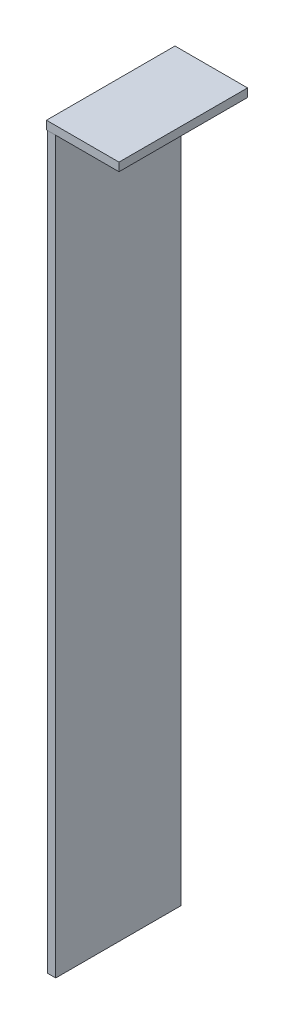
ISO-10303-21;
HEADER;
FILE_DESCRIPTION(('STEP AP214'),'2;1');
FILE_NAME('part.step','',(''),(''),'','','');
FILE_SCHEMA(('AUTOMOTIVE_DESIGN { 1 0 10303 214 1 1 1 1 }'));
ENDSEC;
DATA;
#1=APPLICATION_CONTEXT('core data for automotive mechanical design processes');
#2=APPLICATION_PROTOCOL_DEFINITION('international standard','automotive_design',2000,#1);
#3=PRODUCT_CONTEXT('',#1,'mechanical');
#4=PRODUCT('Part','Part','',(#3));
#5=PRODUCT_RELATED_PRODUCT_CATEGORY('part','',(#4));
#6=PRODUCT_DEFINITION_FORMATION('','',#4);
#7=PRODUCT_DEFINITION_CONTEXT('part definition',#1,'design');
#8=PRODUCT_DEFINITION('design','',#6,#7);
#9=PRODUCT_DEFINITION_SHAPE('','',#8);
#10=(LENGTH_UNIT() NAMED_UNIT(*) SI_UNIT(.MILLI.,.METRE.));
#11=(NAMED_UNIT(*) PLANE_ANGLE_UNIT() SI_UNIT($,.RADIAN.));
#12=(NAMED_UNIT(*) SI_UNIT($,.STERADIAN.) SOLID_ANGLE_UNIT());
#13=UNCERTAINTY_MEASURE_WITH_UNIT(LENGTH_MEASURE(1.E-05),#10,'distance_accuracy_value','');
#14=(GEOMETRIC_REPRESENTATION_CONTEXT(3) GLOBAL_UNCERTAINTY_ASSIGNED_CONTEXT((#13)) GLOBAL_UNIT_ASSIGNED_CONTEXT((#10,
#11,#12)) REPRESENTATION_CONTEXT('',''));
#15=CARTESIAN_POINT('',(0.,0.,0.));
#16=DIRECTION('',(0.,0.,1.));
#17=DIRECTION('',(1.,0.,0.));
#18=AXIS2_PLACEMENT_3D('',#15,#16,#17);
#19=CARTESIAN_POINT('',(2.,50.860137561358,-18.2385278870061));
#20=DIRECTION('',(0.,0.,1.));
#21=DIRECTION('',(0.,-1.,0.));
#22=AXIS2_PLACEMENT_3D('',#19,#20,#21);
#23=PLANE('',#22);
#24=DIRECTION('',(0.,1.,0.));
#25=VECTOR('',#24,1.);
#26=CARTESIAN_POINT('',(0.,50.860137561358,-18.2385278870061));
#27=LINE('',#26,#25);
#28=CARTESIAN_POINT('',(0.,-124.139862438642,-18.2385278870061));
#29=VERTEX_POINT('',#28);
#30=CARTESIAN_POINT('',(0.,50.860137561358,-18.2385278870061));
#31=VERTEX_POINT('',#30);
#32=EDGE_CURVE('E130',#29,#31,#27,.T.);
#33=ORIENTED_EDGE('',*,*,#32,.T.);
#34=DIRECTION('',(-1.,0.,0.));
#35=VECTOR('',#34,1.);
#36=CARTESIAN_POINT('',(2.,50.860137561358,-18.2385278870061));
#37=LINE('',#36,#35);
#38=CARTESIAN_POINT('',(2.,50.860137561358,-18.2385278870061));
#39=VERTEX_POINT('',#38);
#40=EDGE_CURVE('E11',#39,#31,#37,.T.);
#41=ORIENTED_EDGE('',*,*,#40,.F.);
#42=DIRECTION('',(0.,1.,0.));
#43=VECTOR('',#42,1.);
#44=CARTESIAN_POINT('',(2.,50.860137561358,-18.2385278870061));
#45=LINE('',#44,#43);
#46=CARTESIAN_POINT('',(2.,-124.139862438642,-18.2385278870061));
#47=VERTEX_POINT('',#46);
#48=EDGE_CURVE('E74',#47,#39,#45,.T.);
#49=ORIENTED_EDGE('',*,*,#48,.F.);
#50=DIRECTION('',(-1.,0.,0.));
#51=VECTOR('',#50,1.);
#52=CARTESIAN_POINT('',(2.,-124.139862438642,-18.2385278870061));
#53=LINE('',#52,#51);
#54=EDGE_CURVE('E143',#47,#29,#53,.T.);
#55=ORIENTED_EDGE('',*,*,#54,.T.);
#56=EDGE_LOOP('',(#33,#41,#49,#55));
#57=FACE_BOUND('',#56,.T.);
#58=ADVANCED_FACE('F33',(#57),#23,.F.);
#59=CARTESIAN_POINT('',(2.,50.860137561358,11.7614721129939));
#60=DIRECTION('',(0.,0.,-1.));
#61=DIRECTION('',(0.,1.,0.));
#62=AXIS2_PLACEMENT_3D('',#59,#60,#61);
#63=PLANE('',#62);
#64=DIRECTION('',(0.,-1.,0.));
#65=VECTOR('',#64,1.);
#66=CARTESIAN_POINT('',(0.,50.860137561358,11.7614721129939));
#67=LINE('',#66,#65);
#68=CARTESIAN_POINT('',(0.,50.860137561358,11.7614721129939));
#69=VERTEX_POINT('',#68);
#70=CARTESIAN_POINT('',(0.,-124.139862438642,11.7614721129939));
#71=VERTEX_POINT('',#70);
#72=EDGE_CURVE('E63',#69,#71,#67,.T.);
#73=ORIENTED_EDGE('',*,*,#72,.T.);
#74=DIRECTION('',(-1.,0.,0.));
#75=VECTOR('',#74,1.);
#76=CARTESIAN_POINT('',(2.,-124.139862438642,11.7614721129939));
#77=LINE('',#76,#75);
#78=CARTESIAN_POINT('',(2.,-124.139862438642,11.7614721129939));
#79=VERTEX_POINT('',#78);
#80=EDGE_CURVE('E150',#79,#71,#77,.T.);
#81=ORIENTED_EDGE('',*,*,#80,.F.);
#82=DIRECTION('',(0.,-1.,0.));
#83=VECTOR('',#82,1.);
#84=CARTESIAN_POINT('',(2.,50.860137561358,11.7614721129939));
#85=LINE('',#84,#83);
#86=CARTESIAN_POINT('',(2.,50.860137561358,11.7614721129939));
#87=VERTEX_POINT('',#86);
#88=EDGE_CURVE('E141',#87,#79,#85,.T.);
#89=ORIENTED_EDGE('',*,*,#88,.F.);
#90=DIRECTION('',(-1.,0.,0.));
#91=VECTOR('',#90,1.);
#92=CARTESIAN_POINT('',(2.,50.860137561358,11.7614721129939));
#93=LINE('',#92,#91);
#94=EDGE_CURVE('E41',#87,#69,#93,.T.);
#95=ORIENTED_EDGE('',*,*,#94,.T.);
#96=EDGE_LOOP('',(#73,#81,#89,#95));
#97=FACE_BOUND('',#96,.T.);
#98=ADVANCED_FACE('F153',(#97),#63,.F.);
#99=CARTESIAN_POINT('',(2.,-124.139862438642,11.7614721129939));
#100=DIRECTION('',(0.,1.,0.));
#101=DIRECTION('',(0.,0.,1.));
#102=AXIS2_PLACEMENT_3D('',#99,#100,#101);
#103=PLANE('',#102);
#104=DIRECTION('',(0.,0.,-1.));
#105=VECTOR('',#104,1.);
#106=CARTESIAN_POINT('',(0.,-124.139862438642,11.7614721129939));
#107=LINE('',#106,#105);
#108=EDGE_CURVE('E69',#71,#29,#107,.T.);
#109=ORIENTED_EDGE('',*,*,#108,.T.);
#110=ORIENTED_EDGE('',*,*,#54,.F.);
#111=DIRECTION('',(0.,0.,-1.));
#112=VECTOR('',#111,1.);
#113=CARTESIAN_POINT('',(2.,-124.139862438642,11.7614721129939));
#114=LINE('',#113,#112);
#115=EDGE_CURVE('E49',#79,#47,#114,.T.);
#116=ORIENTED_EDGE('',*,*,#115,.F.);
#117=ORIENTED_EDGE('',*,*,#80,.T.);
#118=EDGE_LOOP('',(#109,#110,#116,#117));
#119=FACE_BOUND('',#118,.T.);
#120=ADVANCED_FACE('F162',(#119),#103,.F.);
#121=CARTESIAN_POINT('',(2.,0.,0.));
#122=DIRECTION('',(1.,0.,0.));
#123=DIRECTION('',(0.,0.,-1.));
#124=AXIS2_PLACEMENT_3D('',#121,#122,#123);
#125=PLANE('',#124);
#126=ORIENTED_EDGE('',*,*,#48,.T.);
#127=DIRECTION('',(0.,0.,1.));
#128=VECTOR('',#127,1.);
#129=CARTESIAN_POINT('',(2.,50.860137561358,11.7614721129939));
#130=LINE('',#129,#128);
#131=EDGE_CURVE('E139',#39,#87,#130,.T.);
#132=ORIENTED_EDGE('',*,*,#131,.T.);
#133=ORIENTED_EDGE('',*,*,#88,.T.);
#134=ORIENTED_EDGE('',*,*,#115,.T.);
#135=EDGE_LOOP('',(#126,#132,#133,#134));
#136=FACE_BOUND('',#135,.T.);
#137=ADVANCED_FACE('F164',(#136),#125,.T.);
#138=CARTESIAN_POINT('',(0.,0.,0.));
#139=DIRECTION('',(1.,0.,0.));
#140=DIRECTION('',(0.,0.,-1.));
#141=AXIS2_PLACEMENT_3D('',#138,#139,#140);
#142=PLANE('',#141);
#143=ORIENTED_EDGE('',*,*,#32,.F.);
#144=ORIENTED_EDGE('',*,*,#108,.F.);
#145=ORIENTED_EDGE('',*,*,#72,.F.);
#146=DIRECTION('',(0.,0.,1.));
#147=VECTOR('',#146,1.);
#148=CARTESIAN_POINT('',(0.,50.860137561358,11.7614721129939));
#149=LINE('',#148,#147);
#150=EDGE_CURVE('E132',#31,#69,#149,.T.);
#151=ORIENTED_EDGE('',*,*,#150,.F.);
#152=EDGE_LOOP('',(#143,#144,#145,#151));
#153=FACE_BOUND('',#152,.T.);
#154=ADVANCED_FACE('F159',(#153),#142,.F.);
#155=CARTESIAN_POINT('',(0.,50.860137561358,0.));
#156=DIRECTION('',(0.,1.,0.));
#157=DIRECTION('',(0.,0.,1.));
#158=AXIS2_PLACEMENT_3D('',#155,#156,#157);
#159=PLANE('',#158);
#160=DIRECTION('',(0.,0.,-1.));
#161=VECTOR('',#160,1.);
#162=CARTESIAN_POINT('',(17.2270737115809,50.860137561358,-18.9823979184887));
#163=LINE('',#162,#161);
#164=CARTESIAN_POINT('',(17.2270737115809,50.860137561358,11.8258494855468));
#165=VERTEX_POINT('',#164);
#166=CARTESIAN_POINT('',(17.2270737115809,50.860137561358,-18.9823979184887));
#167=VERTEX_POINT('',#166);
#168=EDGE_CURVE('E129',#165,#167,#163,.T.);
#169=ORIENTED_EDGE('',*,*,#168,.F.);
#170=DIRECTION('',(1.,0.,0.));
#171=VECTOR('',#170,1.);
#172=CARTESIAN_POINT('',(-0.16258094478868,50.860137561358,11.8258494855468));
#173=LINE('',#172,#171);
#174=CARTESIAN_POINT('',(-0.16258094478868,50.860137561358,11.8258494855468));
#175=VERTEX_POINT('',#174);
#176=EDGE_CURVE('E125',#175,#165,#173,.T.);
#177=ORIENTED_EDGE('',*,*,#176,.F.);
#178=DIRECTION('',(0.,0.,1.));
#179=VECTOR('',#178,1.);
#180=CARTESIAN_POINT('',(-0.162580944788683,50.860137561358,-18.9823979184887));
#181=LINE('',#180,#179);
#182=CARTESIAN_POINT('',(-0.162580944788683,50.860137561358,-18.9823979184887));
#183=VERTEX_POINT('',#182);
#184=EDGE_CURVE('E255',#183,#175,#181,.T.);
#185=ORIENTED_EDGE('',*,*,#184,.F.);
#186=DIRECTION('',(-1.,0.,0.));
#187=VECTOR('',#186,1.);
#188=CARTESIAN_POINT('',(-0.162580944788683,50.860137561358,-18.9823979184887));
#189=LINE('',#188,#187);
#190=EDGE_CURVE('E258',#167,#183,#189,.T.);
#191=ORIENTED_EDGE('',*,*,#190,.F.);
#192=EDGE_LOOP('',(#169,#177,#185,#191));
#193=FACE_BOUND('',#192,.T.);
#194=ORIENTED_EDGE('',*,*,#40,.T.);
#195=ORIENTED_EDGE('',*,*,#150,.T.);
#196=ORIENTED_EDGE('',*,*,#94,.F.);
#197=ORIENTED_EDGE('',*,*,#131,.F.);
#198=EDGE_LOOP('',(#194,#195,#196,#197));
#199=FACE_BOUND('',#198,.T.);
#200=ADVANCED_FACE('F160',(#193,#199),#159,.F.);
#201=CARTESIAN_POINT('',(17.2270737115809,52.860137561358,-18.9823979184887));
#202=DIRECTION('',(-1.,0.,0.));
#203=DIRECTION('',(0.,0.,1.));
#204=AXIS2_PLACEMENT_3D('',#201,#202,#203);
#205=PLANE('',#204);
#206=ORIENTED_EDGE('',*,*,#168,.T.);
#207=DIRECTION('',(0.,-1.,0.));
#208=VECTOR('',#207,1.);
#209=CARTESIAN_POINT('',(17.2270737115809,52.860137561358,-18.9823979184887));
#210=LINE('',#209,#208);
#211=CARTESIAN_POINT('',(17.2270737115809,52.860137561358,-18.9823979184887));
#212=VERTEX_POINT('',#211);
#213=EDGE_CURVE('E109',#212,#167,#210,.T.);
#214=ORIENTED_EDGE('',*,*,#213,.F.);
#215=DIRECTION('',(0.,0.,-1.));
#216=VECTOR('',#215,1.);
#217=CARTESIAN_POINT('',(17.2270737115809,52.860137561358,-18.9823979184887));
#218=LINE('',#217,#216);
#219=CARTESIAN_POINT('',(17.2270737115809,52.860137561358,11.8258494855468));
#220=VERTEX_POINT('',#219);
#221=EDGE_CURVE('E116',#220,#212,#218,.T.);
#222=ORIENTED_EDGE('',*,*,#221,.F.);
#223=DIRECTION('',(0.,-1.,0.));
#224=VECTOR('',#223,1.);
#225=CARTESIAN_POINT('',(17.2270737115809,52.860137561358,11.8258494855468));
#226=LINE('',#225,#224);
#227=EDGE_CURVE('E252',#220,#165,#226,.T.);
#228=ORIENTED_EDGE('',*,*,#227,.T.);
#229=EDGE_LOOP('',(#206,#214,#222,#228));
#230=FACE_BOUND('',#229,.T.);
#231=ADVANCED_FACE('F127',(#230),#205,.F.);
#232=CARTESIAN_POINT('',(-0.162580944788683,52.860137561358,-18.9823979184887));
#233=DIRECTION('',(0.,0.,1.));
#234=DIRECTION('',(1.,0.,0.));
#235=AXIS2_PLACEMENT_3D('',#232,#233,#234);
#236=PLANE('',#235);
#237=ORIENTED_EDGE('',*,*,#190,.T.);
#238=DIRECTION('',(0.,-1.,0.));
#239=VECTOR('',#238,1.);
#240=CARTESIAN_POINT('',(-0.162580944788683,52.860137561358,-18.9823979184887));
#241=LINE('',#240,#239);
#242=CARTESIAN_POINT('',(-0.162580944788683,52.860137561358,-18.9823979184887));
#243=VERTEX_POINT('',#242);
#244=EDGE_CURVE('E112',#243,#183,#241,.T.);
#245=ORIENTED_EDGE('',*,*,#244,.F.);
#246=DIRECTION('',(-1.,0.,0.));
#247=VECTOR('',#246,1.);
#248=CARTESIAN_POINT('',(-0.162580944788683,52.860137561358,-18.9823979184887));
#249=LINE('',#248,#247);
#250=EDGE_CURVE('E105',#212,#243,#249,.T.);
#251=ORIENTED_EDGE('',*,*,#250,.F.);
#252=ORIENTED_EDGE('',*,*,#213,.T.);
#253=EDGE_LOOP('',(#237,#245,#251,#252));
#254=FACE_BOUND('',#253,.T.);
#255=ADVANCED_FACE('F107',(#254),#236,.F.);
#256=CARTESIAN_POINT('',(-0.162580944788683,52.860137561358,-18.9823979184887));
#257=DIRECTION('',(1.,0.,0.));
#258=DIRECTION('',(0.,0.,-1.));
#259=AXIS2_PLACEMENT_3D('',#256,#257,#258);
#260=PLANE('',#259);
#261=ORIENTED_EDGE('',*,*,#184,.T.);
#262=DIRECTION('',(0.,-1.,0.));
#263=VECTOR('',#262,1.);
#264=CARTESIAN_POINT('',(-0.16258094478868,52.860137561358,11.8258494855468));
#265=LINE('',#264,#263);
#266=CARTESIAN_POINT('',(-0.16258094478868,52.860137561358,11.8258494855468));
#267=VERTEX_POINT('',#266);
#268=EDGE_CURVE('E134',#267,#175,#265,.T.);
#269=ORIENTED_EDGE('',*,*,#268,.F.);
#270=DIRECTION('',(0.,0.,1.));
#271=VECTOR('',#270,1.);
#272=CARTESIAN_POINT('',(-0.162580944788683,52.860137561358,-18.9823979184887));
#273=LINE('',#272,#271);
#274=EDGE_CURVE('E115',#243,#267,#273,.T.);
#275=ORIENTED_EDGE('',*,*,#274,.F.);
#276=ORIENTED_EDGE('',*,*,#244,.T.);
#277=EDGE_LOOP('',(#261,#269,#275,#276));
#278=FACE_BOUND('',#277,.T.);
#279=ADVANCED_FACE('F219',(#278),#260,.F.);
#280=CARTESIAN_POINT('',(-0.16258094478868,52.860137561358,11.8258494855468));
#281=DIRECTION('',(0.,0.,-1.));
#282=DIRECTION('',(-1.,0.,0.));
#283=AXIS2_PLACEMENT_3D('',#280,#281,#282);
#284=PLANE('',#283);
#285=ORIENTED_EDGE('',*,*,#176,.T.);
#286=ORIENTED_EDGE('',*,*,#227,.F.);
#287=DIRECTION('',(1.,0.,0.));
#288=VECTOR('',#287,1.);
#289=CARTESIAN_POINT('',(-0.16258094478868,52.860137561358,11.8258494855468));
#290=LINE('',#289,#288);
#291=EDGE_CURVE('E121',#267,#220,#290,.T.);
#292=ORIENTED_EDGE('',*,*,#291,.F.);
#293=ORIENTED_EDGE('',*,*,#268,.T.);
#294=EDGE_LOOP('',(#285,#286,#292,#293));
#295=FACE_BOUND('',#294,.T.);
#296=ADVANCED_FACE('F228',(#295),#284,.F.);
#297=CARTESIAN_POINT('',(0.,52.860137561358,0.));
#298=DIRECTION('',(0.,1.,0.));
#299=DIRECTION('',(0.,0.,1.));
#300=AXIS2_PLACEMENT_3D('',#297,#298,#299);
#301=PLANE('',#300);
#302=ORIENTED_EDGE('',*,*,#221,.T.);
#303=ORIENTED_EDGE('',*,*,#250,.T.);
#304=ORIENTED_EDGE('',*,*,#274,.T.);
#305=ORIENTED_EDGE('',*,*,#291,.T.);
#306=EDGE_LOOP('',(#302,#303,#304,#305));
#307=FACE_BOUND('',#306,.T.);
#308=ADVANCED_FACE('F119',(#307),#301,.T.);
#309=CLOSED_SHELL('',(#58,#98,#120,#137,#154,#200,#231,#255,#279,#296,#308));
#310=MANIFOLD_SOLID_BREP('B2',#309);
#311=ADVANCED_BREP_SHAPE_REPRESENTATION('',(#18,#310),#14);
#312=SHAPE_DEFINITION_REPRESENTATION(#9,#311);
ENDSEC;
END-ISO-10303-21;
